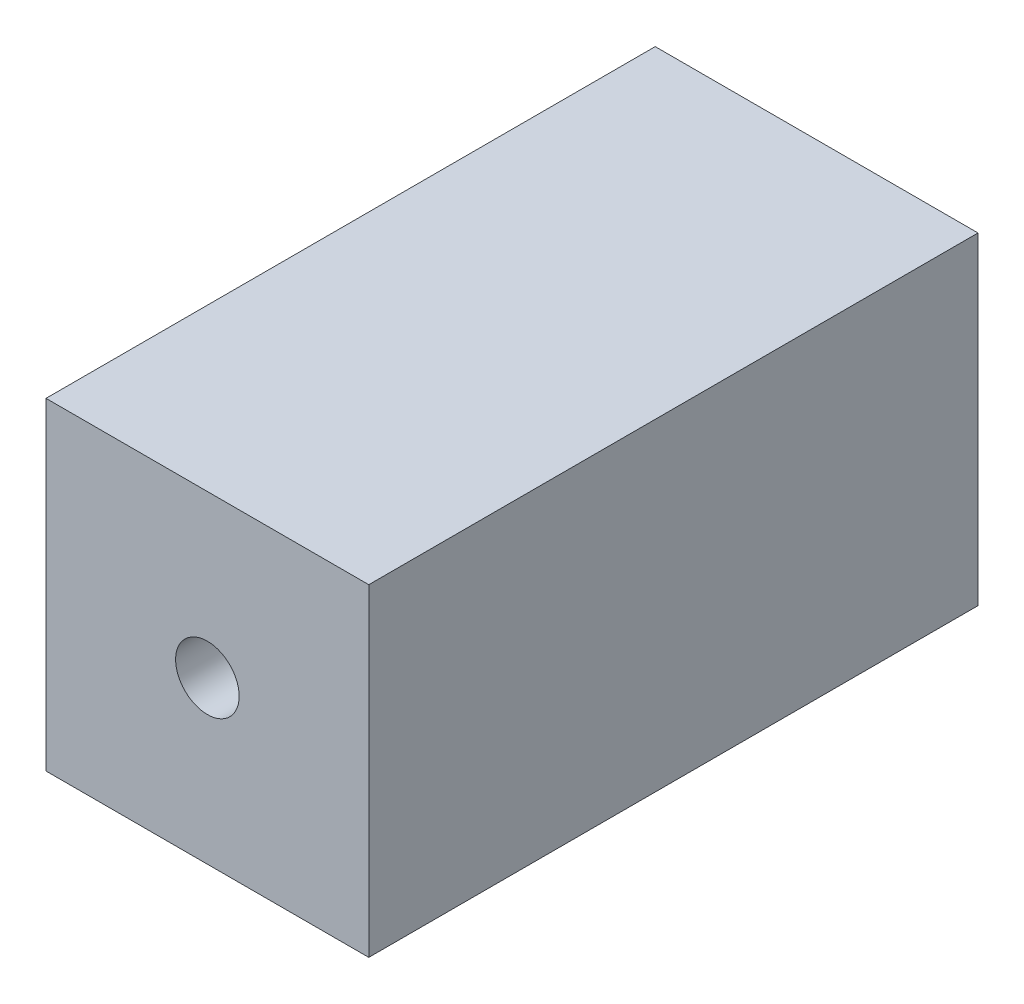
ISO-10303-21;
HEADER;
FILE_DESCRIPTION(('STEP AP214'),'2;1');
FILE_NAME('part.step','',(''),(''),'','','');
FILE_SCHEMA(('AUTOMOTIVE_DESIGN { 1 0 10303 214 1 1 1 1 }'));
ENDSEC;
DATA;
#1=APPLICATION_CONTEXT('core data for automotive mechanical design processes');
#2=APPLICATION_PROTOCOL_DEFINITION('international standard','automotive_design',2000,#1);
#3=PRODUCT_CONTEXT('',#1,'mechanical');
#4=PRODUCT('Part','Part','',(#3));
#5=PRODUCT_RELATED_PRODUCT_CATEGORY('part','',(#4));
#6=PRODUCT_DEFINITION_FORMATION('','',#4);
#7=PRODUCT_DEFINITION_CONTEXT('part definition',#1,'design');
#8=PRODUCT_DEFINITION('design','',#6,#7);
#9=PRODUCT_DEFINITION_SHAPE('','',#8);
#10=(LENGTH_UNIT() NAMED_UNIT(*) SI_UNIT(.MILLI.,.METRE.));
#11=(NAMED_UNIT(*) PLANE_ANGLE_UNIT() SI_UNIT($,.RADIAN.));
#12=(NAMED_UNIT(*) SI_UNIT($,.STERADIAN.) SOLID_ANGLE_UNIT());
#13=UNCERTAINTY_MEASURE_WITH_UNIT(LENGTH_MEASURE(1.E-05),#10,'distance_accuracy_value','');
#14=(GEOMETRIC_REPRESENTATION_CONTEXT(3) GLOBAL_UNCERTAINTY_ASSIGNED_CONTEXT((#13)) GLOBAL_UNIT_ASSIGNED_CONTEXT((#10,
#11,#12)) REPRESENTATION_CONTEXT('',''));
#15=CARTESIAN_POINT('',(0.,0.,0.));
#16=DIRECTION('',(0.,0.,1.));
#17=DIRECTION('',(1.,0.,0.));
#18=AXIS2_PLACEMENT_3D('',#15,#16,#17);
#19=CARTESIAN_POINT('',(12.7,-12.7,23.970292928));
#20=DIRECTION('',(-1.,0.,0.));
#21=DIRECTION('',(0.,0.,1.));
#22=AXIS2_PLACEMENT_3D('',#19,#20,#21);
#23=PLANE('',#22);
#24=DIRECTION('',(0.,1.,0.));
#25=VECTOR('',#24,1.);
#26=CARTESIAN_POINT('',(12.7,-12.7,-23.970292928));
#27=LINE('',#26,#25);
#28=CARTESIAN_POINT('',(12.7,-12.7,-23.970292928));
#29=VERTEX_POINT('',#28);
#30=CARTESIAN_POINT('',(12.7,12.7,-23.970292928));
#31=VERTEX_POINT('',#30);
#32=EDGE_CURVE('E96',#29,#31,#27,.T.);
#33=ORIENTED_EDGE('',*,*,#32,.T.);
#34=DIRECTION('',(0.,0.,-1.));
#35=VECTOR('',#34,1.);
#36=CARTESIAN_POINT('',(12.7,12.7,23.970292928));
#37=LINE('',#36,#35);
#38=CARTESIAN_POINT('',(12.7,12.7,23.970292928));
#39=VERTEX_POINT('',#38);
#40=EDGE_CURVE('E11',#39,#31,#37,.T.);
#41=ORIENTED_EDGE('',*,*,#40,.F.);
#42=DIRECTION('',(0.,1.,0.));
#43=VECTOR('',#42,1.);
#44=CARTESIAN_POINT('',(12.7,-12.7,23.970292928));
#45=LINE('',#44,#43);
#46=CARTESIAN_POINT('',(12.7,-12.7,23.970292928));
#47=VERTEX_POINT('',#46);
#48=EDGE_CURVE('E84',#47,#39,#45,.T.);
#49=ORIENTED_EDGE('',*,*,#48,.F.);
#50=DIRECTION('',(0.,0.,-1.));
#51=VECTOR('',#50,1.);
#52=CARTESIAN_POINT('',(12.7,-12.7,23.970292928));
#53=LINE('',#52,#51);
#54=EDGE_CURVE('E92',#47,#29,#53,.T.);
#55=ORIENTED_EDGE('',*,*,#54,.T.);
#56=EDGE_LOOP('',(#33,#41,#49,#55));
#57=FACE_BOUND('',#56,.T.);
#58=ADVANCED_FACE('F33',(#57),#23,.F.);
#59=CARTESIAN_POINT('',(-12.7,12.7,23.970292928));
#60=DIRECTION('',(0.,-1.,0.));
#61=DIRECTION('',(0.,0.,-1.));
#62=AXIS2_PLACEMENT_3D('',#59,#60,#61);
#63=PLANE('',#62);
#64=DIRECTION('',(-1.,0.,0.));
#65=VECTOR('',#64,1.);
#66=CARTESIAN_POINT('',(-12.7,12.7,-23.970292928));
#67=LINE('',#66,#65);
#68=CARTESIAN_POINT('',(-12.7,12.7,-23.970292928));
#69=VERTEX_POINT('',#68);
#70=EDGE_CURVE('E88',#31,#69,#67,.T.);
#71=ORIENTED_EDGE('',*,*,#70,.T.);
#72=DIRECTION('',(0.,0.,-1.));
#73=VECTOR('',#72,1.);
#74=CARTESIAN_POINT('',(-12.7,12.7,23.970292928));
#75=LINE('',#74,#73);
#76=CARTESIAN_POINT('',(-12.7,12.7,23.970292928));
#77=VERTEX_POINT('',#76);
#78=EDGE_CURVE('E41',#77,#69,#75,.T.);
#79=ORIENTED_EDGE('',*,*,#78,.F.);
#80=DIRECTION('',(-1.,0.,0.));
#81=VECTOR('',#80,1.);
#82=CARTESIAN_POINT('',(-12.7,12.7,23.970292928));
#83=LINE('',#82,#81);
#84=EDGE_CURVE('E79',#39,#77,#83,.T.);
#85=ORIENTED_EDGE('',*,*,#84,.F.);
#86=ORIENTED_EDGE('',*,*,#40,.T.);
#87=EDGE_LOOP('',(#71,#79,#85,#86));
#88=FACE_BOUND('',#87,.T.);
#89=ADVANCED_FACE('F87',(#88),#63,.F.);
#90=CARTESIAN_POINT('',(-12.7,-12.7,23.970292928));
#91=DIRECTION('',(1.,0.,0.));
#92=DIRECTION('',(0.,0.,-1.));
#93=AXIS2_PLACEMENT_3D('',#90,#91,#92);
#94=PLANE('',#93);
#95=DIRECTION('',(0.,-1.,0.));
#96=VECTOR('',#95,1.);
#97=CARTESIAN_POINT('',(-12.7,-12.7,-23.970292928));
#98=LINE('',#97,#96);
#99=CARTESIAN_POINT('',(-12.7,-12.7,-23.970292928));
#100=VERTEX_POINT('',#99);
#101=EDGE_CURVE('E66',#69,#100,#98,.T.);
#102=ORIENTED_EDGE('',*,*,#101,.T.);
#103=DIRECTION('',(0.,0.,-1.));
#104=VECTOR('',#103,1.);
#105=CARTESIAN_POINT('',(-12.7,-12.7,23.970292928));
#106=LINE('',#105,#104);
#107=CARTESIAN_POINT('',(-12.7,-12.7,23.970292928));
#108=VERTEX_POINT('',#107);
#109=EDGE_CURVE('E89',#108,#100,#106,.T.);
#110=ORIENTED_EDGE('',*,*,#109,.F.);
#111=DIRECTION('',(0.,-1.,0.));
#112=VECTOR('',#111,1.);
#113=CARTESIAN_POINT('',(-12.7,-12.7,23.970292928));
#114=LINE('',#113,#112);
#115=EDGE_CURVE('E82',#77,#108,#114,.T.);
#116=ORIENTED_EDGE('',*,*,#115,.F.);
#117=ORIENTED_EDGE('',*,*,#78,.T.);
#118=EDGE_LOOP('',(#102,#110,#116,#117));
#119=FACE_BOUND('',#118,.T.);
#120=ADVANCED_FACE('F90',(#119),#94,.F.);
#121=CARTESIAN_POINT('',(-12.7,-12.7,23.970292928));
#122=DIRECTION('',(0.,1.,0.));
#123=DIRECTION('',(0.,0.,1.));
#124=AXIS2_PLACEMENT_3D('',#121,#122,#123);
#125=PLANE('',#124);
#126=DIRECTION('',(1.,0.,0.));
#127=VECTOR('',#126,1.);
#128=CARTESIAN_POINT('',(-12.7,-12.7,-23.970292928));
#129=LINE('',#128,#127);
#130=EDGE_CURVE('E72',#100,#29,#129,.T.);
#131=ORIENTED_EDGE('',*,*,#130,.T.);
#132=ORIENTED_EDGE('',*,*,#54,.F.);
#133=DIRECTION('',(1.,0.,0.));
#134=VECTOR('',#133,1.);
#135=CARTESIAN_POINT('',(-12.7,-12.7,23.970292928));
#136=LINE('',#135,#134);
#137=EDGE_CURVE('E49',#108,#47,#136,.T.);
#138=ORIENTED_EDGE('',*,*,#137,.F.);
#139=ORIENTED_EDGE('',*,*,#109,.T.);
#140=EDGE_LOOP('',(#131,#132,#138,#139));
#141=FACE_BOUND('',#140,.T.);
#142=ADVANCED_FACE('F104',(#141),#125,.F.);
#143=CARTESIAN_POINT('',(0.,0.,23.970292928));
#144=DIRECTION('',(0.,0.,-1.));
#145=DIRECTION('',(-1.,0.,0.));
#146=AXIS2_PLACEMENT_3D('',#143,#144,#145);
#147=PLANE('',#146);
#148=CARTESIAN_POINT('',(0.,0.,23.970292928));
#149=DIRECTION('',(0.,0.,1.));
#150=DIRECTION('',(1.,0.,0.));
#151=AXIS2_PLACEMENT_3D('',#148,#149,#150);
#152=CIRCLE('',#151,2.5);
#153=CARTESIAN_POINT('',(2.5,0.,23.970292928));
#154=VERTEX_POINT('',#153);
#155=EDGE_CURVE('E110',#154,#154,#152,.T.);
#156=ORIENTED_EDGE('',*,*,#155,.F.);
#157=EDGE_LOOP('',(#156));
#158=FACE_BOUND('',#157,.T.);
#159=ORIENTED_EDGE('',*,*,#48,.T.);
#160=ORIENTED_EDGE('',*,*,#84,.T.);
#161=ORIENTED_EDGE('',*,*,#115,.T.);
#162=ORIENTED_EDGE('',*,*,#137,.T.);
#163=EDGE_LOOP('',(#159,#160,#161,#162));
#164=FACE_BOUND('',#163,.T.);
#165=ADVANCED_FACE('F80',(#158,#164),#147,.F.);
#166=CARTESIAN_POINT('',(0.,0.,-23.970292928));
#167=DIRECTION('',(0.,0.,-1.));
#168=DIRECTION('',(-1.,0.,0.));
#169=AXIS2_PLACEMENT_3D('',#166,#167,#168);
#170=PLANE('',#169);
#171=CARTESIAN_POINT('',(0.,0.,-23.970292928));
#172=DIRECTION('',(0.,0.,1.));
#173=DIRECTION('',(1.,0.,0.));
#174=AXIS2_PLACEMENT_3D('',#171,#172,#173);
#175=CIRCLE('',#174,2.5);
#176=CARTESIAN_POINT('',(2.5,0.,-23.970292928));
#177=VERTEX_POINT('',#176);
#178=EDGE_CURVE('E99',#177,#177,#175,.T.);
#179=ORIENTED_EDGE('',*,*,#178,.T.);
#180=EDGE_LOOP('',(#179));
#181=FACE_BOUND('',#180,.T.);
#182=ORIENTED_EDGE('',*,*,#32,.F.);
#183=ORIENTED_EDGE('',*,*,#130,.F.);
#184=ORIENTED_EDGE('',*,*,#101,.F.);
#185=ORIENTED_EDGE('',*,*,#70,.F.);
#186=EDGE_LOOP('',(#182,#183,#184,#185));
#187=FACE_BOUND('',#186,.T.);
#188=ADVANCED_FACE('F107',(#181,#187),#170,.T.);
#189=CARTESIAN_POINT('',(0.,0.,-23.970292928));
#190=DIRECTION('',(0.,0.,1.));
#191=DIRECTION('',(1.,0.,0.));
#192=AXIS2_PLACEMENT_3D('',#189,#190,#191);
#193=CYLINDRICAL_SURFACE('',#192,2.5);
#194=ORIENTED_EDGE('',*,*,#178,.F.);
#195=EDGE_LOOP('',(#194));
#196=FACE_BOUND('',#195,.T.);
#197=ORIENTED_EDGE('',*,*,#155,.T.);
#198=EDGE_LOOP('',(#197));
#199=FACE_BOUND('',#198,.T.);
#200=ADVANCED_FACE('F117',(#196,#199),#193,.F.);
#201=CLOSED_SHELL('',(#58,#89,#120,#142,#165,#188,#200));
#202=MANIFOLD_SOLID_BREP('B2',#201);
#203=ADVANCED_BREP_SHAPE_REPRESENTATION('',(#18,#202),#14);
#204=SHAPE_DEFINITION_REPRESENTATION(#9,#203);
ENDSEC;
END-ISO-10303-21;
